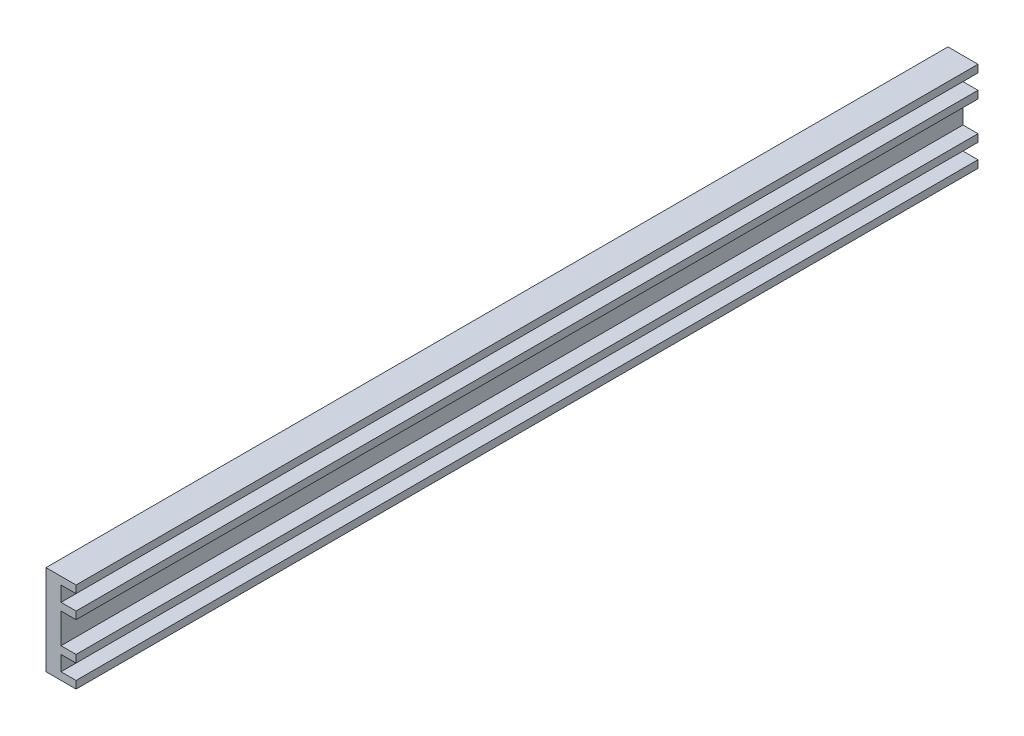
ISO-10303-21;
HEADER;
FILE_DESCRIPTION(('STEP AP214'),'2;1');
FILE_NAME('part.step','',(''),(''),'','','');
FILE_SCHEMA(('AUTOMOTIVE_DESIGN { 1 0 10303 214 1 1 1 1 }'));
ENDSEC;
DATA;
#1=APPLICATION_CONTEXT('core data for automotive mechanical design processes');
#2=APPLICATION_PROTOCOL_DEFINITION('international standard','automotive_design',2000,#1);
#3=PRODUCT_CONTEXT('',#1,'mechanical');
#4=PRODUCT('Part','Part','',(#3));
#5=PRODUCT_RELATED_PRODUCT_CATEGORY('part','',(#4));
#6=PRODUCT_DEFINITION_FORMATION('','',#4);
#7=PRODUCT_DEFINITION_CONTEXT('part definition',#1,'design');
#8=PRODUCT_DEFINITION('design','',#6,#7);
#9=PRODUCT_DEFINITION_SHAPE('','',#8);
#10=(LENGTH_UNIT() NAMED_UNIT(*) SI_UNIT(.MILLI.,.METRE.));
#11=(NAMED_UNIT(*) PLANE_ANGLE_UNIT() SI_UNIT($,.RADIAN.));
#12=(NAMED_UNIT(*) SI_UNIT($,.STERADIAN.) SOLID_ANGLE_UNIT());
#13=UNCERTAINTY_MEASURE_WITH_UNIT(LENGTH_MEASURE(1.E-05),#10,'distance_accuracy_value','');
#14=(GEOMETRIC_REPRESENTATION_CONTEXT(3) GLOBAL_UNCERTAINTY_ASSIGNED_CONTEXT((#13)) GLOBAL_UNIT_ASSIGNED_CONTEXT((#10,
#11,#12)) REPRESENTATION_CONTEXT('',''));
#15=CARTESIAN_POINT('',(0.,0.,0.));
#16=DIRECTION('',(0.,0.,1.));
#17=DIRECTION('',(1.,0.,0.));
#18=AXIS2_PLACEMENT_3D('',#15,#16,#17);
#19=CARTESIAN_POINT('',(6.35,0.,190.5));
#20=DIRECTION('',(-1.,0.,0.));
#21=DIRECTION('',(0.,-1.,0.));
#22=AXIS2_PLACEMENT_3D('',#19,#20,#21);
#23=PLANE('',#22);
#24=DIRECTION('',(0.,1.,0.));
#25=VECTOR('',#24,1.);
#26=CARTESIAN_POINT('',(6.35,0.,0.));
#27=LINE('',#26,#25);
#28=CARTESIAN_POINT('',(6.35,0.,0.));
#29=VERTEX_POINT('',#28);
#30=CARTESIAN_POINT('',(6.35,1.5875,0.));
#31=VERTEX_POINT('',#30);
#32=EDGE_CURVE('E174',#29,#31,#27,.T.);
#33=ORIENTED_EDGE('',*,*,#32,.T.);
#34=DIRECTION('',(0.,0.,1.));
#35=VECTOR('',#34,1.);
#36=CARTESIAN_POINT('',(6.35,1.5875,-0.001000000000001));
#37=LINE('',#36,#35);
#38=CARTESIAN_POINT('',(6.35,1.5875,190.5));
#39=VERTEX_POINT('',#38);
#40=EDGE_CURVE('E276',#31,#39,#37,.T.);
#41=ORIENTED_EDGE('',*,*,#40,.T.);
#42=DIRECTION('',(0.,1.,0.));
#43=VECTOR('',#42,1.);
#44=CARTESIAN_POINT('',(6.35,0.,190.5));
#45=LINE('',#44,#43);
#46=CARTESIAN_POINT('',(6.35,0.,190.5));
#47=VERTEX_POINT('',#46);
#48=EDGE_CURVE('E226',#47,#39,#45,.T.);
#49=ORIENTED_EDGE('',*,*,#48,.F.);
#50=DIRECTION('',(0.,0.,-1.));
#51=VECTOR('',#50,1.);
#52=CARTESIAN_POINT('',(6.35,0.,190.5));
#53=LINE('',#52,#51);
#54=EDGE_CURVE('E11',#47,#29,#53,.T.);
#55=ORIENTED_EDGE('',*,*,#54,.T.);
#56=EDGE_LOOP('',(#33,#41,#49,#55));
#57=FACE_BOUND('',#56,.T.);
#58=ADVANCED_FACE('F33',(#57),#23,.F.);
#59=CARTESIAN_POINT('',(6.35,12.7,0.));
#60=VERTEX_POINT('',#59);
#61=CARTESIAN_POINT('',(6.35,14.2875,0.));
#62=VERTEX_POINT('',#61);
#63=EDGE_CURVE('E171',#60,#62,#27,.T.);
#64=ORIENTED_EDGE('',*,*,#63,.T.);
#65=DIRECTION('',(0.,0.,1.));
#66=VECTOR('',#65,1.);
#67=CARTESIAN_POINT('',(6.35,14.2875,-0.001000000000001));
#68=LINE('',#67,#66);
#69=CARTESIAN_POINT('',(6.35,14.2875,190.5));
#70=VERTEX_POINT('',#69);
#71=EDGE_CURVE('E155',#62,#70,#68,.T.);
#72=ORIENTED_EDGE('',*,*,#71,.T.);
#73=CARTESIAN_POINT('',(6.35,12.7,190.5));
#74=VERTEX_POINT('',#73);
#75=EDGE_CURVE('E253',#74,#70,#45,.T.);
#76=ORIENTED_EDGE('',*,*,#75,.F.);
#77=DIRECTION('',(0.,0.,1.));
#78=VECTOR('',#77,1.);
#79=CARTESIAN_POINT('',(6.35,12.7,-0.001000000000001));
#80=LINE('',#79,#78);
#81=EDGE_CURVE('E215',#60,#74,#80,.T.);
#82=ORIENTED_EDGE('',*,*,#81,.F.);
#83=EDGE_LOOP('',(#64,#72,#76,#82));
#84=FACE_BOUND('',#83,.T.);
#85=ADVANCED_FACE('F301',(#84),#23,.F.);
#86=CARTESIAN_POINT('',(6.35,4.7625,190.5));
#87=VERTEX_POINT('',#86);
#88=CARTESIAN_POINT('',(6.35,6.35,190.5));
#89=VERTEX_POINT('',#88);
#90=EDGE_CURVE('E230',#87,#89,#45,.T.);
#91=ORIENTED_EDGE('',*,*,#90,.F.);
#92=DIRECTION('',(0.,0.,1.));
#93=VECTOR('',#92,1.);
#94=CARTESIAN_POINT('',(6.35,4.7625,-0.001000000000001));
#95=LINE('',#94,#93);
#96=CARTESIAN_POINT('',(6.35,4.7625,0.));
#97=VERTEX_POINT('',#96);
#98=EDGE_CURVE('E194',#97,#87,#95,.T.);
#99=ORIENTED_EDGE('',*,*,#98,.F.);
#100=CARTESIAN_POINT('',(6.35,6.35,0.));
#101=VERTEX_POINT('',#100);
#102=EDGE_CURVE('E176',#97,#101,#27,.T.);
#103=ORIENTED_EDGE('',*,*,#102,.T.);
#104=DIRECTION('',(0.,0.,1.));
#105=VECTOR('',#104,1.);
#106=CARTESIAN_POINT('',(6.35,6.35,-0.001000000000001));
#107=LINE('',#106,#105);
#108=EDGE_CURVE('E192',#101,#89,#107,.T.);
#109=ORIENTED_EDGE('',*,*,#108,.T.);
#110=EDGE_LOOP('',(#91,#99,#103,#109));
#111=FACE_BOUND('',#110,.T.);
#112=ADVANCED_FACE('F191',(#111),#23,.F.);
#113=CARTESIAN_POINT('',(0.,0.,190.5));
#114=DIRECTION('',(0.,1.,0.));
#115=DIRECTION('',(0.,0.,1.));
#116=AXIS2_PLACEMENT_3D('',#113,#114,#115);
#117=PLANE('',#116);
#118=DIRECTION('',(1.,0.,0.));
#119=VECTOR('',#118,1.);
#120=CARTESIAN_POINT('',(0.,0.,0.));
#121=LINE('',#120,#119);
#122=CARTESIAN_POINT('',(0.,0.,0.));
#123=VERTEX_POINT('',#122);
#124=EDGE_CURVE('E172',#123,#29,#121,.T.);
#125=ORIENTED_EDGE('',*,*,#124,.T.);
#126=ORIENTED_EDGE('',*,*,#54,.F.);
#127=DIRECTION('',(1.,0.,0.));
#128=VECTOR('',#127,1.);
#129=CARTESIAN_POINT('',(0.,0.,190.5));
#130=LINE('',#129,#128);
#131=CARTESIAN_POINT('',(0.,0.,190.5));
#132=VERTEX_POINT('',#131);
#133=EDGE_CURVE('E223',#132,#47,#130,.T.);
#134=ORIENTED_EDGE('',*,*,#133,.F.);
#135=DIRECTION('',(0.,0.,-1.));
#136=VECTOR('',#135,1.);
#137=CARTESIAN_POINT('',(0.,0.,190.5));
#138=LINE('',#137,#136);
#139=EDGE_CURVE('E235',#132,#123,#138,.T.);
#140=ORIENTED_EDGE('',*,*,#139,.T.);
#141=EDGE_LOOP('',(#125,#126,#134,#140));
#142=FACE_BOUND('',#141,.T.);
#143=ADVANCED_FACE('F35',(#142),#117,.F.);
#144=CARTESIAN_POINT('',(6.35,17.4625,190.5));
#145=VERTEX_POINT('',#144);
#146=CARTESIAN_POINT('',(6.35,19.05,190.5));
#147=VERTEX_POINT('',#146);
#148=EDGE_CURVE('E163',#145,#147,#45,.T.);
#149=ORIENTED_EDGE('',*,*,#148,.F.);
#150=DIRECTION('',(0.,0.,1.));
#151=VECTOR('',#150,1.);
#152=CARTESIAN_POINT('',(6.35,17.4625,-0.001000000000001));
#153=LINE('',#152,#151);
#154=CARTESIAN_POINT('',(6.35,17.4625,0.));
#155=VERTEX_POINT('',#154);
#156=EDGE_CURVE('E149',#155,#145,#153,.T.);
#157=ORIENTED_EDGE('',*,*,#156,.F.);
#158=CARTESIAN_POINT('',(6.35,19.05,0.));
#159=VERTEX_POINT('',#158);
#160=EDGE_CURVE('E161',#155,#159,#27,.T.);
#161=ORIENTED_EDGE('',*,*,#160,.T.);
#162=DIRECTION('',(0.,0.,-1.));
#163=VECTOR('',#162,1.);
#164=CARTESIAN_POINT('',(6.35,19.05,190.5));
#165=LINE('',#164,#163);
#166=EDGE_CURVE('E41',#147,#159,#165,.T.);
#167=ORIENTED_EDGE('',*,*,#166,.F.);
#168=EDGE_LOOP('',(#149,#157,#161,#167));
#169=FACE_BOUND('',#168,.T.);
#170=ADVANCED_FACE('F159',(#169),#23,.F.);
#171=CARTESIAN_POINT('',(0.,19.05,190.5));
#172=DIRECTION('',(0.,1.,0.));
#173=DIRECTION('',(0.,0.,1.));
#174=AXIS2_PLACEMENT_3D('',#171,#172,#173);
#175=PLANE('',#174);
#176=DIRECTION('',(1.,0.,0.));
#177=VECTOR('',#176,1.);
#178=CARTESIAN_POINT('',(0.,19.05,0.));
#179=LINE('',#178,#177);
#180=CARTESIAN_POINT('',(0.,19.05,0.));
#181=VERTEX_POINT('',#180);
#182=EDGE_CURVE('E170',#181,#159,#179,.T.);
#183=ORIENTED_EDGE('',*,*,#182,.F.);
#184=DIRECTION('',(0.,0.,-1.));
#185=VECTOR('',#184,1.);
#186=CARTESIAN_POINT('',(0.,19.05,190.5));
#187=LINE('',#186,#185);
#188=CARTESIAN_POINT('',(0.,19.05,190.5));
#189=VERTEX_POINT('',#188);
#190=EDGE_CURVE('E238',#189,#181,#187,.T.);
#191=ORIENTED_EDGE('',*,*,#190,.F.);
#192=DIRECTION('',(1.,0.,0.));
#193=VECTOR('',#192,1.);
#194=CARTESIAN_POINT('',(0.,19.05,190.5));
#195=LINE('',#194,#193);
#196=EDGE_CURVE('E229',#189,#147,#195,.T.);
#197=ORIENTED_EDGE('',*,*,#196,.T.);
#198=ORIENTED_EDGE('',*,*,#166,.T.);
#199=EDGE_LOOP('',(#183,#191,#197,#198));
#200=FACE_BOUND('',#199,.T.);
#201=ADVANCED_FACE('F246',(#200),#175,.T.);
#202=CARTESIAN_POINT('',(0.,0.,190.5));
#203=DIRECTION('',(-1.,0.,0.));
#204=DIRECTION('',(0.,0.,1.));
#205=AXIS2_PLACEMENT_3D('',#202,#203,#204);
#206=PLANE('',#205);
#207=DIRECTION('',(0.,1.,0.));
#208=VECTOR('',#207,1.);
#209=CARTESIAN_POINT('',(0.,0.,0.));
#210=LINE('',#209,#208);
#211=EDGE_CURVE('E184',#123,#181,#210,.T.);
#212=ORIENTED_EDGE('',*,*,#211,.F.);
#213=ORIENTED_EDGE('',*,*,#139,.F.);
#214=DIRECTION('',(0.,1.,0.));
#215=VECTOR('',#214,1.);
#216=CARTESIAN_POINT('',(0.,0.,190.5));
#217=LINE('',#216,#215);
#218=EDGE_CURVE('E233',#132,#189,#217,.T.);
#219=ORIENTED_EDGE('',*,*,#218,.T.);
#220=ORIENTED_EDGE('',*,*,#190,.T.);
#221=EDGE_LOOP('',(#212,#213,#219,#220));
#222=FACE_BOUND('',#221,.T.);
#223=ADVANCED_FACE('F331',(#222),#206,.T.);
#224=CARTESIAN_POINT('',(0.,0.,190.5));
#225=DIRECTION('',(0.,0.,1.));
#226=DIRECTION('',(1.,0.,0.));
#227=AXIS2_PLACEMENT_3D('',#224,#225,#226);
#228=PLANE('',#227);
#229=DIRECTION('',(1.,0.,0.));
#230=VECTOR('',#229,1.);
#231=CARTESIAN_POINT('',(6.35,1.5875,190.5));
#232=LINE('',#231,#230);
#233=CARTESIAN_POINT('',(3.175,1.5875,190.5));
#234=VERTEX_POINT('',#233);
#235=EDGE_CURVE('E269',#234,#39,#232,.T.);
#236=ORIENTED_EDGE('',*,*,#235,.F.);
#237=DIRECTION('',(0.,-1.,0.));
#238=VECTOR('',#237,1.);
#239=CARTESIAN_POINT('',(3.175,4.7625,190.5));
#240=LINE('',#239,#238);
#241=CARTESIAN_POINT('',(3.175,4.7625,190.5));
#242=VERTEX_POINT('',#241);
#243=EDGE_CURVE('E265',#242,#234,#240,.T.);
#244=ORIENTED_EDGE('',*,*,#243,.F.);
#245=DIRECTION('',(-1.,0.,0.));
#246=VECTOR('',#245,1.);
#247=CARTESIAN_POINT('',(6.35,4.7625,190.5));
#248=LINE('',#247,#246);
#249=EDGE_CURVE('E263',#87,#242,#248,.T.);
#250=ORIENTED_EDGE('',*,*,#249,.F.);
#251=ORIENTED_EDGE('',*,*,#90,.T.);
#252=DIRECTION('',(1.,0.,0.));
#253=VECTOR('',#252,1.);
#254=CARTESIAN_POINT('',(6.35,6.35,190.5));
#255=LINE('',#254,#253);
#256=CARTESIAN_POINT('',(3.175,6.35,190.5));
#257=VERTEX_POINT('',#256);
#258=EDGE_CURVE('E213',#257,#89,#255,.T.);
#259=ORIENTED_EDGE('',*,*,#258,.F.);
#260=DIRECTION('',(0.,-1.,0.));
#261=VECTOR('',#260,1.);
#262=CARTESIAN_POINT('',(3.175,12.7,190.5));
#263=LINE('',#262,#261);
#264=CARTESIAN_POINT('',(3.175,12.7,190.5));
#265=VERTEX_POINT('',#264);
#266=EDGE_CURVE('E206',#265,#257,#263,.T.);
#267=ORIENTED_EDGE('',*,*,#266,.F.);
#268=DIRECTION('',(-1.,0.,0.));
#269=VECTOR('',#268,1.);
#270=CARTESIAN_POINT('',(6.35,12.7,190.5));
#271=LINE('',#270,#269);
#272=EDGE_CURVE('E203',#74,#265,#271,.T.);
#273=ORIENTED_EDGE('',*,*,#272,.F.);
#274=ORIENTED_EDGE('',*,*,#75,.T.);
#275=DIRECTION('',(1.,0.,0.));
#276=VECTOR('',#275,1.);
#277=CARTESIAN_POINT('',(6.35,14.2875,190.5));
#278=LINE('',#277,#276);
#279=CARTESIAN_POINT('',(3.175,14.2875,190.5));
#280=VERTEX_POINT('',#279);
#281=EDGE_CURVE('E164',#280,#70,#278,.T.);
#282=ORIENTED_EDGE('',*,*,#281,.F.);
#283=DIRECTION('',(0.,-1.,0.));
#284=VECTOR('',#283,1.);
#285=CARTESIAN_POINT('',(3.175,17.4625,190.5));
#286=LINE('',#285,#284);
#287=CARTESIAN_POINT('',(3.175,17.4625,190.5));
#288=VERTEX_POINT('',#287);
#289=EDGE_CURVE('E288',#288,#280,#286,.T.);
#290=ORIENTED_EDGE('',*,*,#289,.F.);
#291=DIRECTION('',(-1.,0.,0.));
#292=VECTOR('',#291,1.);
#293=CARTESIAN_POINT('',(6.35,17.4625,190.5));
#294=LINE('',#293,#292);
#295=EDGE_CURVE('E252',#145,#288,#294,.T.);
#296=ORIENTED_EDGE('',*,*,#295,.F.);
#297=ORIENTED_EDGE('',*,*,#148,.T.);
#298=ORIENTED_EDGE('',*,*,#196,.F.);
#299=ORIENTED_EDGE('',*,*,#218,.F.);
#300=ORIENTED_EDGE('',*,*,#133,.T.);
#301=ORIENTED_EDGE('',*,*,#48,.T.);
#302=EDGE_LOOP('',(#236,#244,#250,#251,#259,#267,#273,#274,#282,#290,#296,#297,#298,#299,#300,#301));
#303=FACE_BOUND('',#302,.T.);
#304=ADVANCED_FACE('F250',(#303),#228,.T.);
#305=CARTESIAN_POINT('',(0.,0.,0.));
#306=DIRECTION('',(0.,0.,1.));
#307=DIRECTION('',(1.,0.,0.));
#308=AXIS2_PLACEMENT_3D('',#305,#306,#307);
#309=PLANE('',#308);
#310=DIRECTION('',(0.,1.,0.));
#311=VECTOR('',#310,1.);
#312=CARTESIAN_POINT('',(3.175,4.7625,0.));
#313=LINE('',#312,#311);
#314=CARTESIAN_POINT('',(3.175,1.5875,0.));
#315=VERTEX_POINT('',#314);
#316=CARTESIAN_POINT('',(3.175,4.7625,0.));
#317=VERTEX_POINT('',#316);
#318=EDGE_CURVE('E48',#315,#317,#313,.T.);
#319=ORIENTED_EDGE('',*,*,#318,.F.);
#320=DIRECTION('',(-1.,0.,0.));
#321=VECTOR('',#320,1.);
#322=CARTESIAN_POINT('',(6.35,1.5875,0.));
#323=LINE('',#322,#321);
#324=EDGE_CURVE('E267',#31,#315,#323,.T.);
#325=ORIENTED_EDGE('',*,*,#324,.F.);
#326=ORIENTED_EDGE('',*,*,#32,.F.);
#327=ORIENTED_EDGE('',*,*,#124,.F.);
#328=ORIENTED_EDGE('',*,*,#211,.T.);
#329=ORIENTED_EDGE('',*,*,#182,.T.);
#330=ORIENTED_EDGE('',*,*,#160,.F.);
#331=DIRECTION('',(1.,0.,0.));
#332=VECTOR('',#331,1.);
#333=CARTESIAN_POINT('',(6.35,17.4625,0.));
#334=LINE('',#333,#332);
#335=CARTESIAN_POINT('',(3.175,17.4625,0.));
#336=VERTEX_POINT('',#335);
#337=EDGE_CURVE('E145',#336,#155,#334,.T.);
#338=ORIENTED_EDGE('',*,*,#337,.F.);
#339=DIRECTION('',(0.,1.,0.));
#340=VECTOR('',#339,1.);
#341=CARTESIAN_POINT('',(3.175,17.4625,0.));
#342=LINE('',#341,#340);
#343=CARTESIAN_POINT('',(3.175,14.2875,0.));
#344=VERTEX_POINT('',#343);
#345=EDGE_CURVE('E56',#344,#336,#342,.T.);
#346=ORIENTED_EDGE('',*,*,#345,.F.);
#347=DIRECTION('',(-1.,0.,0.));
#348=VECTOR('',#347,1.);
#349=CARTESIAN_POINT('',(6.35,14.2875,0.));
#350=LINE('',#349,#348);
#351=EDGE_CURVE('E282',#62,#344,#350,.T.);
#352=ORIENTED_EDGE('',*,*,#351,.F.);
#353=ORIENTED_EDGE('',*,*,#63,.F.);
#354=DIRECTION('',(1.,0.,0.));
#355=VECTOR('',#354,1.);
#356=CARTESIAN_POINT('',(6.35,12.7,0.));
#357=LINE('',#356,#355);
#358=CARTESIAN_POINT('',(3.175,12.7,0.));
#359=VERTEX_POINT('',#358);
#360=EDGE_CURVE('E178',#359,#60,#357,.T.);
#361=ORIENTED_EDGE('',*,*,#360,.F.);
#362=DIRECTION('',(0.,1.,0.));
#363=VECTOR('',#362,1.);
#364=CARTESIAN_POINT('',(3.175,12.7,0.));
#365=LINE('',#364,#363);
#366=CARTESIAN_POINT('',(3.175,6.35,0.));
#367=VERTEX_POINT('',#366);
#368=EDGE_CURVE('E154',#367,#359,#365,.T.);
#369=ORIENTED_EDGE('',*,*,#368,.F.);
#370=DIRECTION('',(-1.,0.,0.));
#371=VECTOR('',#370,1.);
#372=CARTESIAN_POINT('',(6.35,6.35,0.));
#373=LINE('',#372,#371);
#374=EDGE_CURVE('E200',#101,#367,#373,.T.);
#375=ORIENTED_EDGE('',*,*,#374,.F.);
#376=ORIENTED_EDGE('',*,*,#102,.F.);
#377=DIRECTION('',(1.,0.,0.));
#378=VECTOR('',#377,1.);
#379=CARTESIAN_POINT('',(6.35,4.7625,0.));
#380=LINE('',#379,#378);
#381=EDGE_CURVE('E197',#317,#97,#380,.T.);
#382=ORIENTED_EDGE('',*,*,#381,.F.);
#383=EDGE_LOOP('',(#319,#325,#326,#327,#328,#329,#330,#338,#346,#352,#353,#361,#369,#375,#376,#382));
#384=FACE_BOUND('',#383,.T.);
#385=ADVANCED_FACE('F167',(#384),#309,.F.);
#386=CARTESIAN_POINT('',(6.35,6.35,-0.001000000000001));
#387=DIRECTION('',(0.,-1.,0.));
#388=DIRECTION('',(0.,0.,-1.));
#389=AXIS2_PLACEMENT_3D('',#386,#387,#388);
#390=PLANE('',#389);
#391=ORIENTED_EDGE('',*,*,#374,.T.);
#392=DIRECTION('',(0.,0.,1.));
#393=VECTOR('',#392,1.);
#394=CARTESIAN_POINT('',(3.175,6.35,-0.001000000000001));
#395=LINE('',#394,#393);
#396=EDGE_CURVE('E217',#367,#257,#395,.T.);
#397=ORIENTED_EDGE('',*,*,#396,.T.);
#398=ORIENTED_EDGE('',*,*,#258,.T.);
#399=ORIENTED_EDGE('',*,*,#108,.F.);
#400=EDGE_LOOP('',(#391,#397,#398,#399));
#401=FACE_BOUND('',#400,.T.);
#402=ADVANCED_FACE('F309',(#401),#390,.F.);
#403=CARTESIAN_POINT('',(3.175,12.7,-0.001000000000001));
#404=DIRECTION('',(-1.,0.,0.));
#405=DIRECTION('',(0.,-1.,0.));
#406=AXIS2_PLACEMENT_3D('',#403,#404,#405);
#407=PLANE('',#406);
#408=ORIENTED_EDGE('',*,*,#368,.T.);
#409=DIRECTION('',(0.,0.,1.));
#410=VECTOR('',#409,1.);
#411=CARTESIAN_POINT('',(3.175,12.7,-0.001000000000001));
#412=LINE('',#411,#410);
#413=EDGE_CURVE('E219',#359,#265,#412,.T.);
#414=ORIENTED_EDGE('',*,*,#413,.T.);
#415=ORIENTED_EDGE('',*,*,#266,.T.);
#416=ORIENTED_EDGE('',*,*,#396,.F.);
#417=EDGE_LOOP('',(#408,#414,#415,#416));
#418=FACE_BOUND('',#417,.T.);
#419=ADVANCED_FACE('F308',(#418),#407,.F.);
#420=CARTESIAN_POINT('',(6.35,12.7,-0.001000000000001));
#421=DIRECTION('',(0.,1.,0.));
#422=DIRECTION('',(0.,0.,1.));
#423=AXIS2_PLACEMENT_3D('',#420,#421,#422);
#424=PLANE('',#423);
#425=ORIENTED_EDGE('',*,*,#360,.T.);
#426=ORIENTED_EDGE('',*,*,#81,.T.);
#427=ORIENTED_EDGE('',*,*,#272,.T.);
#428=ORIENTED_EDGE('',*,*,#413,.F.);
#429=EDGE_LOOP('',(#425,#426,#427,#428));
#430=FACE_BOUND('',#429,.T.);
#431=ADVANCED_FACE('F306',(#430),#424,.F.);
#432=CARTESIAN_POINT('',(6.35,14.2875,-0.001000000000001));
#433=DIRECTION('',(0.,-1.,0.));
#434=DIRECTION('',(1.,0.,0.));
#435=AXIS2_PLACEMENT_3D('',#432,#433,#434);
#436=PLANE('',#435);
#437=ORIENTED_EDGE('',*,*,#351,.T.);
#438=DIRECTION('',(0.,0.,1.));
#439=VECTOR('',#438,1.);
#440=CARTESIAN_POINT('',(3.175,14.2875,-0.001000000000001));
#441=LINE('',#440,#439);
#442=EDGE_CURVE('E294',#344,#280,#441,.T.);
#443=ORIENTED_EDGE('',*,*,#442,.T.);
#444=ORIENTED_EDGE('',*,*,#281,.T.);
#445=ORIENTED_EDGE('',*,*,#71,.F.);
#446=EDGE_LOOP('',(#437,#443,#444,#445));
#447=FACE_BOUND('',#446,.T.);
#448=ADVANCED_FACE('F298',(#447),#436,.F.);
#449=CARTESIAN_POINT('',(3.175,17.4625,-0.001000000000001));
#450=DIRECTION('',(-1.,0.,0.));
#451=DIRECTION('',(0.,0.,1.));
#452=AXIS2_PLACEMENT_3D('',#449,#450,#451);
#453=PLANE('',#452);
#454=ORIENTED_EDGE('',*,*,#345,.T.);
#455=DIRECTION('',(0.,0.,1.));
#456=VECTOR('',#455,1.);
#457=CARTESIAN_POINT('',(3.175,17.4625,-0.001000000000001));
#458=LINE('',#457,#456);
#459=EDGE_CURVE('E151',#336,#288,#458,.T.);
#460=ORIENTED_EDGE('',*,*,#459,.T.);
#461=ORIENTED_EDGE('',*,*,#289,.T.);
#462=ORIENTED_EDGE('',*,*,#442,.F.);
#463=EDGE_LOOP('',(#454,#460,#461,#462));
#464=FACE_BOUND('',#463,.T.);
#465=ADVANCED_FACE('F296',(#464),#453,.F.);
#466=CARTESIAN_POINT('',(6.35,17.4625,-0.001000000000001));
#467=DIRECTION('',(0.,1.,0.));
#468=DIRECTION('',(0.,0.,1.));
#469=AXIS2_PLACEMENT_3D('',#466,#467,#468);
#470=PLANE('',#469);
#471=ORIENTED_EDGE('',*,*,#337,.T.);
#472=ORIENTED_EDGE('',*,*,#156,.T.);
#473=ORIENTED_EDGE('',*,*,#295,.T.);
#474=ORIENTED_EDGE('',*,*,#459,.F.);
#475=EDGE_LOOP('',(#471,#472,#473,#474));
#476=FACE_BOUND('',#475,.T.);
#477=ADVANCED_FACE('F147',(#476),#470,.F.);
#478=CARTESIAN_POINT('',(6.35,1.5875,-0.001000000000001));
#479=DIRECTION('',(0.,-1.,0.));
#480=DIRECTION('',(1.,0.,0.));
#481=AXIS2_PLACEMENT_3D('',#478,#479,#480);
#482=PLANE('',#481);
#483=ORIENTED_EDGE('',*,*,#324,.T.);
#484=DIRECTION('',(0.,0.,1.));
#485=VECTOR('',#484,1.);
#486=CARTESIAN_POINT('',(3.175,1.5875,-0.001000000000001));
#487=LINE('',#486,#485);
#488=EDGE_CURVE('E278',#315,#234,#487,.T.);
#489=ORIENTED_EDGE('',*,*,#488,.T.);
#490=ORIENTED_EDGE('',*,*,#235,.T.);
#491=ORIENTED_EDGE('',*,*,#40,.F.);
#492=EDGE_LOOP('',(#483,#489,#490,#491));
#493=FACE_BOUND('',#492,.T.);
#494=ADVANCED_FACE('F385',(#493),#482,.F.);
#495=CARTESIAN_POINT('',(3.175,4.7625,-0.001000000000001));
#496=DIRECTION('',(-1.,0.,0.));
#497=DIRECTION('',(0.,-1.,0.));
#498=AXIS2_PLACEMENT_3D('',#495,#496,#497);
#499=PLANE('',#498);
#500=ORIENTED_EDGE('',*,*,#318,.T.);
#501=DIRECTION('',(0.,0.,1.));
#502=VECTOR('',#501,1.);
#503=CARTESIAN_POINT('',(3.175,4.7625,-0.001000000000001));
#504=LINE('',#503,#502);
#505=EDGE_CURVE('E280',#317,#242,#504,.T.);
#506=ORIENTED_EDGE('',*,*,#505,.T.);
#507=ORIENTED_EDGE('',*,*,#243,.T.);
#508=ORIENTED_EDGE('',*,*,#488,.F.);
#509=EDGE_LOOP('',(#500,#506,#507,#508));
#510=FACE_BOUND('',#509,.T.);
#511=ADVANCED_FACE('F393',(#510),#499,.F.);
#512=CARTESIAN_POINT('',(6.35,4.7625,-0.001000000000001));
#513=DIRECTION('',(0.,1.,0.));
#514=DIRECTION('',(0.,0.,1.));
#515=AXIS2_PLACEMENT_3D('',#512,#513,#514);
#516=PLANE('',#515);
#517=ORIENTED_EDGE('',*,*,#381,.T.);
#518=ORIENTED_EDGE('',*,*,#98,.T.);
#519=ORIENTED_EDGE('',*,*,#249,.T.);
#520=ORIENTED_EDGE('',*,*,#505,.F.);
#521=EDGE_LOOP('',(#517,#518,#519,#520));
#522=FACE_BOUND('',#521,.T.);
#523=ADVANCED_FACE('F402',(#522),#516,.F.);
#524=CLOSED_SHELL('',(#58,#85,#112,#143,#170,#201,#223,#304,#385,#402,#419,#431,#448,#465,#477,
#494,#511,#523));
#525=MANIFOLD_SOLID_BREP('B2',#524);
#526=ADVANCED_BREP_SHAPE_REPRESENTATION('',(#18,#525),#14);
#527=SHAPE_DEFINITION_REPRESENTATION(#9,#526);
ENDSEC;
END-ISO-10303-21;
